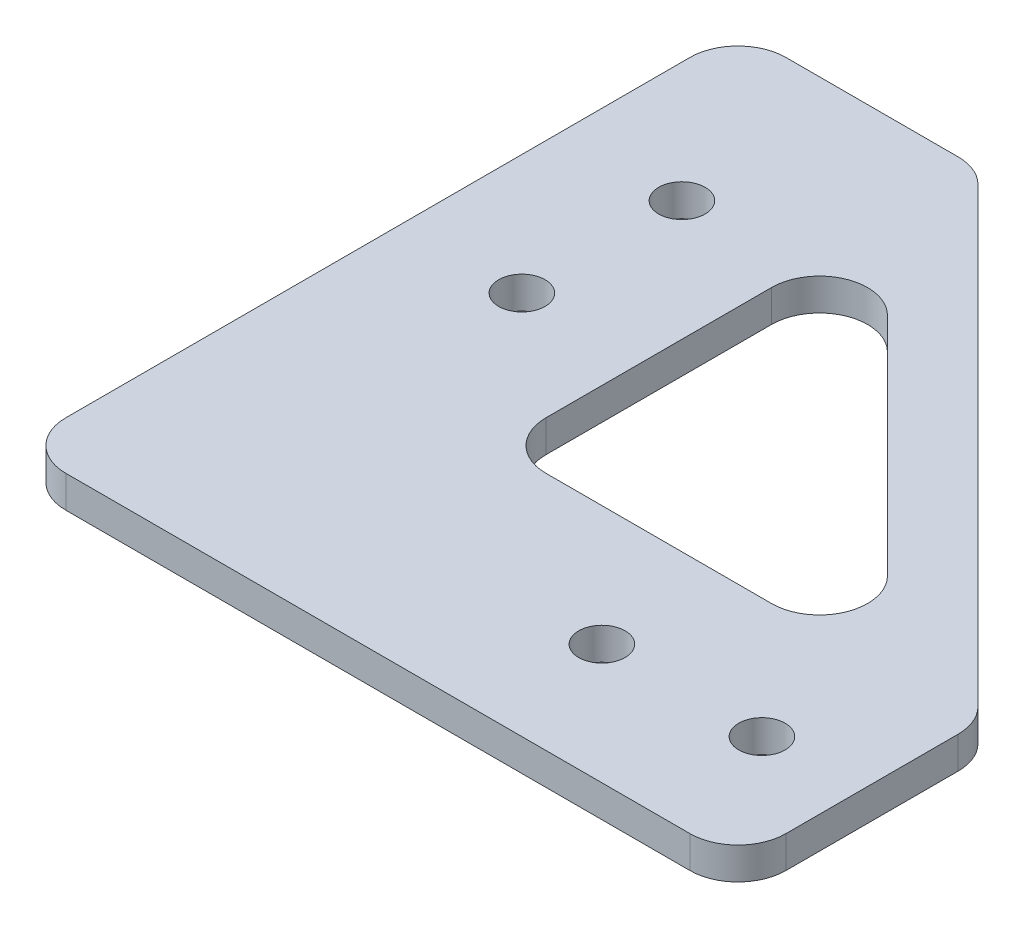
ISO-10303-21;
HEADER;
FILE_DESCRIPTION(('STEP AP214'),'2;1');
FILE_NAME('part.step','',(''),(''),'','','');
FILE_SCHEMA(('AUTOMOTIVE_DESIGN { 1 0 10303 214 1 1 1 1 }'));
ENDSEC;
DATA;
#1=APPLICATION_CONTEXT('core data for automotive mechanical design processes');
#2=APPLICATION_PROTOCOL_DEFINITION('international standard','automotive_design',2000,#1);
#3=PRODUCT_CONTEXT('',#1,'mechanical');
#4=PRODUCT('Part','Part','',(#3));
#5=PRODUCT_RELATED_PRODUCT_CATEGORY('part','',(#4));
#6=PRODUCT_DEFINITION_FORMATION('','',#4);
#7=PRODUCT_DEFINITION_CONTEXT('part definition',#1,'design');
#8=PRODUCT_DEFINITION('design','',#6,#7);
#9=PRODUCT_DEFINITION_SHAPE('','',#8);
#10=(LENGTH_UNIT() NAMED_UNIT(*) SI_UNIT(.MILLI.,.METRE.));
#11=(NAMED_UNIT(*) PLANE_ANGLE_UNIT() SI_UNIT($,.RADIAN.));
#12=(NAMED_UNIT(*) SI_UNIT($,.STERADIAN.) SOLID_ANGLE_UNIT());
#13=UNCERTAINTY_MEASURE_WITH_UNIT(LENGTH_MEASURE(1.E-05),#10,'distance_accuracy_value','');
#14=(GEOMETRIC_REPRESENTATION_CONTEXT(3) GLOBAL_UNCERTAINTY_ASSIGNED_CONTEXT((#13)) GLOBAL_UNIT_ASSIGNED_CONTEXT((#10,
#11,#12)) REPRESENTATION_CONTEXT('',''));
#15=CARTESIAN_POINT('',(0.,0.,0.));
#16=DIRECTION('',(0.,0.,1.));
#17=DIRECTION('',(1.,0.,0.));
#18=AXIS2_PLACEMENT_3D('',#15,#16,#17);
#19=CARTESIAN_POINT('',(0.,2.,-45.));
#20=DIRECTION('',(0.,0.,-1.));
#21=DIRECTION('',(-1.,0.,0.));
#22=AXIS2_PLACEMENT_3D('',#19,#20,#21);
#23=PLANE('',#22);
#24=DIRECTION('',(1.,0.,0.));
#25=VECTOR('',#24,1.);
#26=CARTESIAN_POINT('',(0.,0.,-45.));
#27=LINE('',#26,#25);
#28=CARTESIAN_POINT('',(3.,0.,-45.));
#29=VERTEX_POINT('',#28);
#30=CARTESIAN_POINT('',(13.7573593128807,0.,-45.));
#31=VERTEX_POINT('',#30);
#32=EDGE_CURVE('E312',#29,#31,#27,.T.);
#33=ORIENTED_EDGE('',*,*,#32,.F.);
#34=DIRECTION('',(0.,-1.,0.));
#35=VECTOR('',#34,1.);
#36=CARTESIAN_POINT('',(3.,2.,-45.));
#37=LINE('',#36,#35);
#38=CARTESIAN_POINT('',(3.,2.,-45.));
#39=VERTEX_POINT('',#38);
#40=EDGE_CURVE('E221',#29,#39,#37,.F.);
#41=ORIENTED_EDGE('',*,*,#40,.T.);
#42=DIRECTION('',(1.,0.,0.));
#43=VECTOR('',#42,1.);
#44=CARTESIAN_POINT('',(0.,2.,-45.));
#45=LINE('',#44,#43);
#46=CARTESIAN_POINT('',(13.7573593128807,2.,-45.));
#47=VERTEX_POINT('',#46);
#48=EDGE_CURVE('E281',#39,#47,#45,.T.);
#49=ORIENTED_EDGE('',*,*,#48,.T.);
#50=DIRECTION('',(0.,-1.,0.));
#51=VECTOR('',#50,1.);
#52=CARTESIAN_POINT('',(13.7573593128807,2.,-45.));
#53=LINE('',#52,#51);
#54=EDGE_CURVE('E218',#47,#31,#53,.T.);
#55=ORIENTED_EDGE('',*,*,#54,.T.);
#56=EDGE_LOOP('',(#33,#41,#49,#55));
#57=FACE_BOUND('',#56,.T.);
#58=ADVANCED_FACE('F45',(#57),#23,.T.);
#59=CARTESIAN_POINT('',(0.,2.,0.));
#60=DIRECTION('',(-1.,0.,0.));
#61=DIRECTION('',(0.,0.,1.));
#62=AXIS2_PLACEMENT_3D('',#59,#60,#61);
#63=PLANE('',#62);
#64=DIRECTION('',(0.,0.,-1.));
#65=VECTOR('',#64,1.);
#66=CARTESIAN_POINT('',(0.,0.,0.));
#67=LINE('',#66,#65);
#68=CARTESIAN_POINT('',(0.,0.,-3.));
#69=VERTEX_POINT('',#68);
#70=CARTESIAN_POINT('',(0.,0.,-42.));
#71=VERTEX_POINT('',#70);
#72=EDGE_CURVE('E189',#69,#71,#67,.T.);
#73=ORIENTED_EDGE('',*,*,#72,.F.);
#74=DIRECTION('',(0.,-1.,0.));
#75=VECTOR('',#74,1.);
#76=CARTESIAN_POINT('',(0.,2.,-3.));
#77=LINE('',#76,#75);
#78=CARTESIAN_POINT('',(0.,2.,-3.));
#79=VERTEX_POINT('',#78);
#80=EDGE_CURVE('E216',#69,#79,#77,.F.);
#81=ORIENTED_EDGE('',*,*,#80,.T.);
#82=DIRECTION('',(0.,0.,-1.));
#83=VECTOR('',#82,1.);
#84=CARTESIAN_POINT('',(0.,2.,0.));
#85=LINE('',#84,#83);
#86=CARTESIAN_POINT('',(0.,2.,-42.));
#87=VERTEX_POINT('',#86);
#88=EDGE_CURVE('E289',#79,#87,#85,.T.);
#89=ORIENTED_EDGE('',*,*,#88,.T.);
#90=DIRECTION('',(0.,-1.,0.));
#91=VECTOR('',#90,1.);
#92=CARTESIAN_POINT('',(0.,2.,-42.));
#93=LINE('',#92,#91);
#94=EDGE_CURVE('E213',#87,#71,#93,.T.);
#95=ORIENTED_EDGE('',*,*,#94,.T.);
#96=EDGE_LOOP('',(#73,#81,#89,#95));
#97=FACE_BOUND('',#96,.T.);
#98=ADVANCED_FACE('F319',(#97),#63,.T.);
#99=CARTESIAN_POINT('',(0.,2.,0.));
#100=DIRECTION('',(0.,0.,-1.));
#101=DIRECTION('',(-1.,0.,0.));
#102=AXIS2_PLACEMENT_3D('',#99,#100,#101);
#103=PLANE('',#102);
#104=DIRECTION('',(1.,0.,0.));
#105=VECTOR('',#104,1.);
#106=CARTESIAN_POINT('',(0.,0.,0.));
#107=LINE('',#106,#105);
#108=CARTESIAN_POINT('',(3.,0.,0.));
#109=VERTEX_POINT('',#108);
#110=CARTESIAN_POINT('',(42.,0.,0.));
#111=VERTEX_POINT('',#110);
#112=EDGE_CURVE('E185',#109,#111,#107,.T.);
#113=ORIENTED_EDGE('',*,*,#112,.T.);
#114=DIRECTION('',(0.,-1.,0.));
#115=VECTOR('',#114,1.);
#116=CARTESIAN_POINT('',(42.,2.,0.));
#117=LINE('',#116,#115);
#118=CARTESIAN_POINT('',(42.,2.,0.));
#119=VERTEX_POINT('',#118);
#120=EDGE_CURVE('E164',#111,#119,#117,.F.);
#121=ORIENTED_EDGE('',*,*,#120,.T.);
#122=DIRECTION('',(1.,0.,0.));
#123=VECTOR('',#122,1.);
#124=CARTESIAN_POINT('',(0.,2.,0.));
#125=LINE('',#124,#123);
#126=CARTESIAN_POINT('',(3.,2.,0.));
#127=VERTEX_POINT('',#126);
#128=EDGE_CURVE('E292',#127,#119,#125,.T.);
#129=ORIENTED_EDGE('',*,*,#128,.F.);
#130=DIRECTION('',(0.,-1.,0.));
#131=VECTOR('',#130,1.);
#132=CARTESIAN_POINT('',(3.,0.,0.));
#133=LINE('',#132,#131);
#134=EDGE_CURVE('E169',#127,#109,#133,.T.);
#135=ORIENTED_EDGE('',*,*,#134,.T.);
#136=EDGE_LOOP('',(#113,#121,#129,#135));
#137=FACE_BOUND('',#136,.T.);
#138=ADVANCED_FACE('F328',(#137),#103,.F.);
#139=CARTESIAN_POINT('',(45.,2.,0.));
#140=DIRECTION('',(-1.,0.,0.));
#141=DIRECTION('',(0.,0.,1.));
#142=AXIS2_PLACEMENT_3D('',#139,#140,#141);
#143=PLANE('',#142);
#144=DIRECTION('',(0.,0.,-1.));
#145=VECTOR('',#144,1.);
#146=CARTESIAN_POINT('',(45.,2.,0.));
#147=LINE('',#146,#145);
#148=CARTESIAN_POINT('',(45.,2.,-3.));
#149=VERTEX_POINT('',#148);
#150=CARTESIAN_POINT('',(45.,2.,-13.7573593128807));
#151=VERTEX_POINT('',#150);
#152=EDGE_CURVE('E178',#149,#151,#147,.T.);
#153=ORIENTED_EDGE('',*,*,#152,.F.);
#154=DIRECTION('',(0.,-1.,0.));
#155=VECTOR('',#154,1.);
#156=CARTESIAN_POINT('',(45.,2.,-3.));
#157=LINE('',#156,#155);
#158=CARTESIAN_POINT('',(45.,0.,-3.));
#159=VERTEX_POINT('',#158);
#160=EDGE_CURVE('E163',#149,#159,#157,.T.);
#161=ORIENTED_EDGE('',*,*,#160,.T.);
#162=DIRECTION('',(0.,0.,-1.));
#163=VECTOR('',#162,1.);
#164=CARTESIAN_POINT('',(45.,0.,0.));
#165=LINE('',#164,#163);
#166=CARTESIAN_POINT('',(45.,0.,-13.7573593128807));
#167=VERTEX_POINT('',#166);
#168=EDGE_CURVE('E176',#159,#167,#165,.T.);
#169=ORIENTED_EDGE('',*,*,#168,.T.);
#170=DIRECTION('',(0.,-1.,0.));
#171=VECTOR('',#170,1.);
#172=CARTESIAN_POINT('',(45.,2.,-13.7573593128807));
#173=LINE('',#172,#171);
#174=EDGE_CURVE('E180',#167,#151,#173,.F.);
#175=ORIENTED_EDGE('',*,*,#174,.T.);
#176=EDGE_LOOP('',(#153,#161,#169,#175));
#177=FACE_BOUND('',#176,.T.);
#178=ADVANCED_FACE('F175',(#177),#143,.F.);
#179=CARTESIAN_POINT('',(27.1715728752538,2.,-27.1715728752538));
#180=DIRECTION('',(-0.707106781186547,0.,0.707106781186548));
#181=DIRECTION('',(0.707106781186548,0.,0.707106781186547));
#182=AXIS2_PLACEMENT_3D('',#179,#180,#181);
#183=PLANE('',#182);
#184=DIRECTION('',(-0.707106781186548,0.,-0.707106781186547));
#185=VECTOR('',#184,1.);
#186=CARTESIAN_POINT('',(27.1715728752538,2.,-27.1715728752538));
#187=LINE('',#186,#185);
#188=CARTESIAN_POINT('',(34.221825406948,2.,-20.1213203435596));
#189=VERTEX_POINT('',#188);
#190=CARTESIAN_POINT('',(20.1213203435596,2.,-34.221825406948));
#191=VERTEX_POINT('',#190);
#192=EDGE_CURVE('E274',#189,#191,#187,.T.);
#193=ORIENTED_EDGE('',*,*,#192,.T.);
#194=DIRECTION('',(0.,-1.,0.));
#195=VECTOR('',#194,1.);
#196=CARTESIAN_POINT('',(20.1213203435596,0.,-34.221825406948));
#197=LINE('',#196,#195);
#198=CARTESIAN_POINT('',(20.1213203435596,0.,-34.221825406948));
#199=VERTEX_POINT('',#198);
#200=EDGE_CURVE('E225',#191,#199,#197,.T.);
#201=ORIENTED_EDGE('',*,*,#200,.T.);
#202=DIRECTION('',(-0.707106781186548,0.,-0.707106781186547));
#203=VECTOR('',#202,1.);
#204=CARTESIAN_POINT('',(27.1715728752538,0.,-27.1715728752538));
#205=LINE('',#204,#203);
#206=CARTESIAN_POINT('',(34.221825406948,0.,-20.1213203435596));
#207=VERTEX_POINT('',#206);
#208=EDGE_CURVE('E253',#207,#199,#205,.T.);
#209=ORIENTED_EDGE('',*,*,#208,.F.);
#210=DIRECTION('',(0.,-1.,0.));
#211=VECTOR('',#210,1.);
#212=CARTESIAN_POINT('',(34.221825406948,2.,-20.1213203435596));
#213=LINE('',#212,#211);
#214=EDGE_CURVE('E223',#207,#189,#213,.F.);
#215=ORIENTED_EDGE('',*,*,#214,.T.);
#216=EDGE_LOOP('',(#193,#201,#209,#215));
#217=FACE_BOUND('',#216,.T.);
#218=ADVANCED_FACE('F261',(#217),#183,.T.);
#219=CARTESIAN_POINT('',(0.,2.,-15.));
#220=DIRECTION('',(0.,0.,-1.));
#221=DIRECTION('',(-1.,0.,0.));
#222=AXIS2_PLACEMENT_3D('',#219,#220,#221);
#223=PLANE('',#222);
#224=DIRECTION('',(1.,0.,0.));
#225=VECTOR('',#224,1.);
#226=CARTESIAN_POINT('',(0.,0.,-15.));
#227=LINE('',#226,#225);
#228=CARTESIAN_POINT('',(18.,0.,-15.));
#229=VERTEX_POINT('',#228);
#230=CARTESIAN_POINT('',(32.1005050633883,0.,-15.));
#231=VERTEX_POINT('',#230);
#232=EDGE_CURVE('E255',#229,#231,#227,.T.);
#233=ORIENTED_EDGE('',*,*,#232,.F.);
#234=DIRECTION('',(0.,-1.,0.));
#235=VECTOR('',#234,1.);
#236=CARTESIAN_POINT('',(18.,2.,-15.));
#237=LINE('',#236,#235);
#238=CARTESIAN_POINT('',(18.,2.,-15.));
#239=VERTEX_POINT('',#238);
#240=EDGE_CURVE('E236',#229,#239,#237,.F.);
#241=ORIENTED_EDGE('',*,*,#240,.T.);
#242=DIRECTION('',(1.,0.,0.));
#243=VECTOR('',#242,1.);
#244=CARTESIAN_POINT('',(0.,2.,-15.));
#245=LINE('',#244,#243);
#246=CARTESIAN_POINT('',(32.1005050633883,2.,-15.));
#247=VERTEX_POINT('',#246);
#248=EDGE_CURVE('E272',#239,#247,#245,.T.);
#249=ORIENTED_EDGE('',*,*,#248,.T.);
#250=DIRECTION('',(0.,-1.,0.));
#251=VECTOR('',#250,1.);
#252=CARTESIAN_POINT('',(32.1005050633883,0.,-15.));
#253=LINE('',#252,#251);
#254=EDGE_CURVE('E233',#247,#231,#253,.T.);
#255=ORIENTED_EDGE('',*,*,#254,.T.);
#256=EDGE_LOOP('',(#233,#241,#249,#255));
#257=FACE_BOUND('',#256,.T.);
#258=ADVANCED_FACE('F276',(#257),#223,.T.);
#259=CARTESIAN_POINT('',(15.,2.,0.));
#260=DIRECTION('',(1.,0.,0.));
#261=DIRECTION('',(0.,0.,-1.));
#262=AXIS2_PLACEMENT_3D('',#259,#260,#261);
#263=PLANE('',#262);
#264=DIRECTION('',(0.,0.,1.));
#265=VECTOR('',#264,1.);
#266=CARTESIAN_POINT('',(15.,0.,0.));
#267=LINE('',#266,#265);
#268=CARTESIAN_POINT('',(15.,0.,-32.1005050633883));
#269=VERTEX_POINT('',#268);
#270=CARTESIAN_POINT('',(15.,0.,-18.));
#271=VERTEX_POINT('',#270);
#272=EDGE_CURVE('E309',#269,#271,#267,.T.);
#273=ORIENTED_EDGE('',*,*,#272,.F.);
#274=DIRECTION('',(0.,-1.,0.));
#275=VECTOR('',#274,1.);
#276=CARTESIAN_POINT('',(15.,2.,-32.1005050633883));
#277=LINE('',#276,#275);
#278=CARTESIAN_POINT('',(15.,2.,-32.1005050633883));
#279=VERTEX_POINT('',#278);
#280=EDGE_CURVE('E231',#269,#279,#277,.F.);
#281=ORIENTED_EDGE('',*,*,#280,.T.);
#282=DIRECTION('',(0.,0.,1.));
#283=VECTOR('',#282,1.);
#284=CARTESIAN_POINT('',(15.,2.,0.));
#285=LINE('',#284,#283);
#286=CARTESIAN_POINT('',(15.,2.,-18.));
#287=VERTEX_POINT('',#286);
#288=EDGE_CURVE('E278',#279,#287,#285,.T.);
#289=ORIENTED_EDGE('',*,*,#288,.T.);
#290=DIRECTION('',(0.,-1.,0.));
#291=VECTOR('',#290,1.);
#292=CARTESIAN_POINT('',(15.,0.,-18.));
#293=LINE('',#292,#291);
#294=EDGE_CURVE('E228',#287,#271,#293,.T.);
#295=ORIENTED_EDGE('',*,*,#294,.T.);
#296=EDGE_LOOP('',(#273,#281,#289,#295));
#297=FACE_BOUND('',#296,.T.);
#298=ADVANCED_FACE('F344',(#297),#263,.T.);
#299=CARTESIAN_POINT('',(29.,2.,-7.5));
#300=DIRECTION('',(0.,-1.,0.));
#301=DIRECTION('',(0.,0.,-1.));
#302=AXIS2_PLACEMENT_3D('',#299,#300,#301);
#303=CYLINDRICAL_SURFACE('',#302,1.45);
#304=CARTESIAN_POINT('',(29.,2.,-7.5));
#305=DIRECTION('',(0.,1.,0.));
#306=DIRECTION('',(0.,0.,1.));
#307=AXIS2_PLACEMENT_3D('',#304,#305,#306);
#308=CIRCLE('',#307,1.45);
#309=CARTESIAN_POINT('',(29.,2.,-6.05));
#310=VERTEX_POINT('',#309);
#311=EDGE_CURVE('E283',#310,#310,#308,.T.);
#312=ORIENTED_EDGE('',*,*,#311,.T.);
#313=EDGE_LOOP('',(#312));
#314=FACE_BOUND('',#313,.T.);
#315=CARTESIAN_POINT('',(29.,0.,-7.5));
#316=DIRECTION('',(0.,1.,0.));
#317=DIRECTION('',(0.,0.,1.));
#318=AXIS2_PLACEMENT_3D('',#315,#316,#317);
#319=CIRCLE('',#318,1.45);
#320=CARTESIAN_POINT('',(29.,0.,-6.05));
#321=VERTEX_POINT('',#320);
#322=EDGE_CURVE('E264',#321,#321,#319,.T.);
#323=ORIENTED_EDGE('',*,*,#322,.F.);
#324=EDGE_LOOP('',(#323));
#325=FACE_BOUND('',#324,.T.);
#326=ADVANCED_FACE('F347',(#314,#325),#303,.F.);
#327=CARTESIAN_POINT('',(39.,2.,-7.5));
#328=DIRECTION('',(0.,-1.,0.));
#329=DIRECTION('',(0.,0.,-1.));
#330=AXIS2_PLACEMENT_3D('',#327,#328,#329);
#331=CYLINDRICAL_SURFACE('',#330,1.45);
#332=CARTESIAN_POINT('',(39.,2.,-7.5));
#333=DIRECTION('',(0.,1.,0.));
#334=DIRECTION('',(0.,0.,1.));
#335=AXIS2_PLACEMENT_3D('',#332,#333,#334);
#336=CIRCLE('',#335,1.45);
#337=CARTESIAN_POINT('',(39.,2.,-6.05));
#338=VERTEX_POINT('',#337);
#339=EDGE_CURVE('E559',#338,#338,#336,.T.);
#340=ORIENTED_EDGE('',*,*,#339,.T.);
#341=EDGE_LOOP('',(#340));
#342=FACE_BOUND('',#341,.T.);
#343=CARTESIAN_POINT('',(39.,0.,-7.5));
#344=DIRECTION('',(0.,1.,0.));
#345=DIRECTION('',(0.,0.,1.));
#346=AXIS2_PLACEMENT_3D('',#343,#344,#345);
#347=CIRCLE('',#346,1.45);
#348=CARTESIAN_POINT('',(39.,0.,-6.05));
#349=VERTEX_POINT('',#348);
#350=EDGE_CURVE('E303',#349,#349,#347,.T.);
#351=ORIENTED_EDGE('',*,*,#350,.F.);
#352=EDGE_LOOP('',(#351));
#353=FACE_BOUND('',#352,.T.);
#354=ADVANCED_FACE('F355',(#342,#353),#331,.F.);
#355=CARTESIAN_POINT('',(7.5,2.,-24.));
#356=DIRECTION('',(0.,-1.,0.));
#357=DIRECTION('',(0.,0.,-1.));
#358=AXIS2_PLACEMENT_3D('',#355,#356,#357);
#359=CYLINDRICAL_SURFACE('',#358,1.45);
#360=CARTESIAN_POINT('',(7.5,2.,-24.));
#361=DIRECTION('',(0.,1.,0.));
#362=DIRECTION('',(0.,0.,1.));
#363=AXIS2_PLACEMENT_3D('',#360,#361,#362);
#364=CIRCLE('',#363,1.45);
#365=CARTESIAN_POINT('',(7.5,2.,-22.55));
#366=VERTEX_POINT('',#365);
#367=EDGE_CURVE('E555',#366,#366,#364,.T.);
#368=ORIENTED_EDGE('',*,*,#367,.T.);
#369=EDGE_LOOP('',(#368));
#370=FACE_BOUND('',#369,.T.);
#371=CARTESIAN_POINT('',(7.5,0.,-24.));
#372=DIRECTION('',(0.,1.,0.));
#373=DIRECTION('',(0.,0.,1.));
#374=AXIS2_PLACEMENT_3D('',#371,#372,#373);
#375=CIRCLE('',#374,1.45);
#376=CARTESIAN_POINT('',(7.5,0.,-22.55));
#377=VERTEX_POINT('',#376);
#378=EDGE_CURVE('E300',#377,#377,#375,.T.);
#379=ORIENTED_EDGE('',*,*,#378,.F.);
#380=EDGE_LOOP('',(#379));
#381=FACE_BOUND('',#380,.T.);
#382=ADVANCED_FACE('F359',(#370,#381),#359,.F.);
#383=CARTESIAN_POINT('',(7.5,2.,-34.));
#384=DIRECTION('',(0.,-1.,0.));
#385=DIRECTION('',(0.,0.,-1.));
#386=AXIS2_PLACEMENT_3D('',#383,#384,#385);
#387=CYLINDRICAL_SURFACE('',#386,1.45);
#388=CARTESIAN_POINT('',(7.5,2.,-34.));
#389=DIRECTION('',(0.,1.,0.));
#390=DIRECTION('',(0.,0.,1.));
#391=AXIS2_PLACEMENT_3D('',#388,#389,#390);
#392=CIRCLE('',#391,1.45);
#393=CARTESIAN_POINT('',(7.5,2.,-32.55));
#394=VERTEX_POINT('',#393);
#395=EDGE_CURVE('E187',#394,#394,#392,.T.);
#396=ORIENTED_EDGE('',*,*,#395,.T.);
#397=EDGE_LOOP('',(#396));
#398=FACE_BOUND('',#397,.T.);
#399=CARTESIAN_POINT('',(7.5,0.,-34.));
#400=DIRECTION('',(0.,1.,0.));
#401=DIRECTION('',(0.,0.,1.));
#402=AXIS2_PLACEMENT_3D('',#399,#400,#401);
#403=CIRCLE('',#402,1.45);
#404=CARTESIAN_POINT('',(7.5,0.,-32.55));
#405=VERTEX_POINT('',#404);
#406=EDGE_CURVE('E297',#405,#405,#403,.T.);
#407=ORIENTED_EDGE('',*,*,#406,.F.);
#408=EDGE_LOOP('',(#407));
#409=FACE_BOUND('',#408,.T.);
#410=ADVANCED_FACE('F363',(#398,#409),#387,.F.);
#411=CARTESIAN_POINT('',(30.,2.,-30.));
#412=DIRECTION('',(0.707106781186547,0.,-0.707106781186548));
#413=DIRECTION('',(-0.707106781186548,0.,-0.707106781186547));
#414=AXIS2_PLACEMENT_3D('',#411,#412,#413);
#415=PLANE('',#414);
#416=DIRECTION('',(0.707106781186548,0.,0.707106781186547));
#417=VECTOR('',#416,1.);
#418=CARTESIAN_POINT('',(30.,0.,-30.));
#419=LINE('',#418,#417);
#420=CARTESIAN_POINT('',(15.8786796564404,0.,-44.1213203435596));
#421=VERTEX_POINT('',#420);
#422=CARTESIAN_POINT('',(44.1213203435596,0.,-15.8786796564404));
#423=VERTEX_POINT('',#422);
#424=EDGE_CURVE('E184',#421,#423,#419,.T.);
#425=ORIENTED_EDGE('',*,*,#424,.F.);
#426=DIRECTION('',(0.,-1.,0.));
#427=VECTOR('',#426,1.);
#428=CARTESIAN_POINT('',(15.8786796564404,2.,-44.1213203435596));
#429=LINE('',#428,#427);
#430=CARTESIAN_POINT('',(15.8786796564404,2.,-44.1213203435596));
#431=VERTEX_POINT('',#430);
#432=EDGE_CURVE('E67',#421,#431,#429,.F.);
#433=ORIENTED_EDGE('',*,*,#432,.T.);
#434=DIRECTION('',(0.707106781186548,0.,0.707106781186547));
#435=VECTOR('',#434,1.);
#436=CARTESIAN_POINT('',(30.,2.,-30.));
#437=LINE('',#436,#435);
#438=CARTESIAN_POINT('',(44.1213203435596,2.,-15.8786796564404));
#439=VERTEX_POINT('',#438);
#440=EDGE_CURVE('E193',#431,#439,#437,.T.);
#441=ORIENTED_EDGE('',*,*,#440,.T.);
#442=DIRECTION('',(0.,-1.,0.));
#443=VECTOR('',#442,1.);
#444=CARTESIAN_POINT('',(44.1213203435596,0.,-15.8786796564404));
#445=LINE('',#444,#443);
#446=EDGE_CURVE('E238',#439,#423,#445,.T.);
#447=ORIENTED_EDGE('',*,*,#446,.T.);
#448=EDGE_LOOP('',(#425,#433,#441,#447));
#449=FACE_BOUND('',#448,.T.);
#450=ADVANCED_FACE('F366',(#449),#415,.T.);
#451=CARTESIAN_POINT('',(0.,2.,0.));
#452=DIRECTION('',(0.,1.,0.));
#453=DIRECTION('',(0.,0.,1.));
#454=AXIS2_PLACEMENT_3D('',#451,#452,#453);
#455=PLANE('',#454);
#456=ORIENTED_EDGE('',*,*,#395,.F.);
#457=EDGE_LOOP('',(#456));
#458=FACE_BOUND('',#457,.T.);
#459=ORIENTED_EDGE('',*,*,#367,.F.);
#460=EDGE_LOOP('',(#459));
#461=FACE_BOUND('',#460,.T.);
#462=ORIENTED_EDGE('',*,*,#339,.F.);
#463=EDGE_LOOP('',(#462));
#464=FACE_BOUND('',#463,.T.);
#465=ORIENTED_EDGE('',*,*,#311,.F.);
#466=EDGE_LOOP('',(#465));
#467=FACE_BOUND('',#466,.T.);
#468=ORIENTED_EDGE('',*,*,#192,.F.);
#469=CARTESIAN_POINT('',(32.1005050633883,2.,-18.));
#470=DIRECTION('',(0.,1.,0.));
#471=DIRECTION('',(0.,0.,1.));
#472=AXIS2_PLACEMENT_3D('',#469,#470,#471);
#473=CIRCLE('',#472,3.);
#474=EDGE_CURVE('E11',#189,#247,#473,.F.);
#475=ORIENTED_EDGE('',*,*,#474,.T.);
#476=ORIENTED_EDGE('',*,*,#248,.F.);
#477=CARTESIAN_POINT('',(18.,2.,-18.));
#478=DIRECTION('',(0.,1.,0.));
#479=DIRECTION('',(0.,0.,1.));
#480=AXIS2_PLACEMENT_3D('',#477,#478,#479);
#481=CIRCLE('',#480,3.);
#482=EDGE_CURVE('E248',#239,#287,#481,.F.);
#483=ORIENTED_EDGE('',*,*,#482,.T.);
#484=ORIENTED_EDGE('',*,*,#288,.F.);
#485=CARTESIAN_POINT('',(18.,2.,-32.1005050633883));
#486=DIRECTION('',(0.,1.,0.));
#487=DIRECTION('',(0.,0.,1.));
#488=AXIS2_PLACEMENT_3D('',#485,#486,#487);
#489=CIRCLE('',#488,3.);
#490=EDGE_CURVE('E244',#279,#191,#489,.F.);
#491=ORIENTED_EDGE('',*,*,#490,.T.);
#492=EDGE_LOOP('',(#468,#475,#476,#483,#484,#491));
#493=FACE_BOUND('',#492,.T.);
#494=ORIENTED_EDGE('',*,*,#128,.T.);
#495=CARTESIAN_POINT('',(42.,2.,-3.));
#496=DIRECTION('',(0.,1.,0.));
#497=DIRECTION('',(0.,0.,1.));
#498=AXIS2_PLACEMENT_3D('',#495,#496,#497);
#499=CIRCLE('',#498,3.);
#500=EDGE_CURVE('E211',#119,#149,#499,.T.);
#501=ORIENTED_EDGE('',*,*,#500,.T.);
#502=ORIENTED_EDGE('',*,*,#152,.T.);
#503=CARTESIAN_POINT('',(42.,2.,-13.7573593128807));
#504=DIRECTION('',(0.,1.,0.));
#505=DIRECTION('',(0.,0.,1.));
#506=AXIS2_PLACEMENT_3D('',#503,#504,#505);
#507=CIRCLE('',#506,3.);
#508=EDGE_CURVE('E60',#151,#439,#507,.T.);
#509=ORIENTED_EDGE('',*,*,#508,.T.);
#510=ORIENTED_EDGE('',*,*,#440,.F.);
#511=CARTESIAN_POINT('',(13.7573593128807,2.,-42.));
#512=DIRECTION('',(0.,1.,0.));
#513=DIRECTION('',(0.,0.,1.));
#514=AXIS2_PLACEMENT_3D('',#511,#512,#513);
#515=CIRCLE('',#514,3.);
#516=EDGE_CURVE('E205',#431,#47,#515,.T.);
#517=ORIENTED_EDGE('',*,*,#516,.T.);
#518=ORIENTED_EDGE('',*,*,#48,.F.);
#519=CARTESIAN_POINT('',(3.,2.,-42.));
#520=DIRECTION('',(0.,1.,0.));
#521=DIRECTION('',(0.,0.,1.));
#522=AXIS2_PLACEMENT_3D('',#519,#520,#521);
#523=CIRCLE('',#522,3.);
#524=EDGE_CURVE('E207',#39,#87,#523,.T.);
#525=ORIENTED_EDGE('',*,*,#524,.T.);
#526=ORIENTED_EDGE('',*,*,#88,.F.);
#527=CARTESIAN_POINT('',(3.,2.,-3.));
#528=DIRECTION('',(0.,1.,0.));
#529=DIRECTION('',(0.,0.,1.));
#530=AXIS2_PLACEMENT_3D('',#527,#528,#529);
#531=CIRCLE('',#530,3.);
#532=EDGE_CURVE('E209',#79,#127,#531,.T.);
#533=ORIENTED_EDGE('',*,*,#532,.T.);
#534=EDGE_LOOP('',(#494,#501,#502,#509,#510,#517,#518,#525,#526,#533));
#535=FACE_BOUND('',#534,.T.);
#536=ADVANCED_FACE('F271',(#458,#461,#464,#467,#493,#535),#455,.T.);
#537=CARTESIAN_POINT('',(0.,0.,0.));
#538=DIRECTION('',(0.,1.,0.));
#539=DIRECTION('',(0.,0.,1.));
#540=AXIS2_PLACEMENT_3D('',#537,#538,#539);
#541=PLANE('',#540);
#542=ORIENTED_EDGE('',*,*,#406,.T.);
#543=EDGE_LOOP('',(#542));
#544=FACE_BOUND('',#543,.T.);
#545=ORIENTED_EDGE('',*,*,#378,.T.);
#546=EDGE_LOOP('',(#545));
#547=FACE_BOUND('',#546,.T.);
#548=ORIENTED_EDGE('',*,*,#350,.T.);
#549=EDGE_LOOP('',(#548));
#550=FACE_BOUND('',#549,.T.);
#551=ORIENTED_EDGE('',*,*,#322,.T.);
#552=EDGE_LOOP('',(#551));
#553=FACE_BOUND('',#552,.T.);
#554=ORIENTED_EDGE('',*,*,#232,.T.);
#555=CARTESIAN_POINT('',(32.1005050633883,0.,-18.));
#556=DIRECTION('',(0.,1.,0.));
#557=DIRECTION('',(0.,0.,1.));
#558=AXIS2_PLACEMENT_3D('',#555,#556,#557);
#559=CIRCLE('',#558,3.);
#560=EDGE_CURVE('E53',#231,#207,#559,.T.);
#561=ORIENTED_EDGE('',*,*,#560,.T.);
#562=ORIENTED_EDGE('',*,*,#208,.T.);
#563=CARTESIAN_POINT('',(18.,0.,-32.1005050633883));
#564=DIRECTION('',(0.,1.,0.));
#565=DIRECTION('',(0.,0.,1.));
#566=AXIS2_PLACEMENT_3D('',#563,#564,#565);
#567=CIRCLE('',#566,3.);
#568=EDGE_CURVE('E242',#199,#269,#567,.T.);
#569=ORIENTED_EDGE('',*,*,#568,.T.);
#570=ORIENTED_EDGE('',*,*,#272,.T.);
#571=CARTESIAN_POINT('',(18.,0.,-18.));
#572=DIRECTION('',(0.,1.,0.));
#573=DIRECTION('',(0.,0.,1.));
#574=AXIS2_PLACEMENT_3D('',#571,#572,#573);
#575=CIRCLE('',#574,3.);
#576=EDGE_CURVE('E246',#271,#229,#575,.T.);
#577=ORIENTED_EDGE('',*,*,#576,.T.);
#578=EDGE_LOOP('',(#554,#561,#562,#569,#570,#577));
#579=FACE_BOUND('',#578,.T.);
#580=ORIENTED_EDGE('',*,*,#168,.F.);
#581=CARTESIAN_POINT('',(42.,0.,-3.));
#582=DIRECTION('',(0.,1.,0.));
#583=DIRECTION('',(0.,0.,1.));
#584=AXIS2_PLACEMENT_3D('',#581,#582,#583);
#585=CIRCLE('',#584,3.);
#586=EDGE_CURVE('E159',#159,#111,#585,.F.);
#587=ORIENTED_EDGE('',*,*,#586,.T.);
#588=ORIENTED_EDGE('',*,*,#112,.F.);
#589=CARTESIAN_POINT('',(3.,0.,-3.));
#590=DIRECTION('',(0.,1.,0.));
#591=DIRECTION('',(0.,0.,1.));
#592=AXIS2_PLACEMENT_3D('',#589,#590,#591);
#593=CIRCLE('',#592,3.);
#594=EDGE_CURVE('E170',#109,#69,#593,.F.);
#595=ORIENTED_EDGE('',*,*,#594,.T.);
#596=ORIENTED_EDGE('',*,*,#72,.T.);
#597=CARTESIAN_POINT('',(3.,0.,-42.));
#598=DIRECTION('',(0.,1.,0.));
#599=DIRECTION('',(0.,0.,1.));
#600=AXIS2_PLACEMENT_3D('',#597,#598,#599);
#601=CIRCLE('',#600,3.);
#602=EDGE_CURVE('E198',#71,#29,#601,.F.);
#603=ORIENTED_EDGE('',*,*,#602,.T.);
#604=ORIENTED_EDGE('',*,*,#32,.T.);
#605=CARTESIAN_POINT('',(13.7573593128807,0.,-42.));
#606=DIRECTION('',(0.,1.,0.));
#607=DIRECTION('',(0.,0.,1.));
#608=AXIS2_PLACEMENT_3D('',#605,#606,#607);
#609=CIRCLE('',#608,3.);
#610=EDGE_CURVE('E196',#31,#421,#609,.F.);
#611=ORIENTED_EDGE('',*,*,#610,.T.);
#612=ORIENTED_EDGE('',*,*,#424,.T.);
#613=CARTESIAN_POINT('',(42.,0.,-13.7573593128807));
#614=DIRECTION('',(0.,1.,0.));
#615=DIRECTION('',(0.,0.,1.));
#616=AXIS2_PLACEMENT_3D('',#613,#614,#615);
#617=CIRCLE('',#616,3.);
#618=EDGE_CURVE('E179',#423,#167,#617,.F.);
#619=ORIENTED_EDGE('',*,*,#618,.T.);
#620=EDGE_LOOP('',(#580,#587,#588,#595,#596,#603,#604,#611,#612,#619));
#621=FACE_BOUND('',#620,.T.);
#622=ADVANCED_FACE('F182',(#544,#547,#550,#553,#579,#621),#541,.F.);
#623=CARTESIAN_POINT('',(42.,2.,-3.));
#624=DIRECTION('',(0.,-1.,0.));
#625=DIRECTION('',(0.,0.,-1.));
#626=AXIS2_PLACEMENT_3D('',#623,#624,#625);
#627=CYLINDRICAL_SURFACE('',#626,3.);
#628=ORIENTED_EDGE('',*,*,#500,.F.);
#629=ORIENTED_EDGE('',*,*,#120,.F.);
#630=ORIENTED_EDGE('',*,*,#586,.F.);
#631=ORIENTED_EDGE('',*,*,#160,.F.);
#632=EDGE_LOOP('',(#628,#629,#630,#631));
#633=FACE_BOUND('',#632,.T.);
#634=ADVANCED_FACE('F162',(#633),#627,.T.);
#635=CARTESIAN_POINT('',(3.,2.,-3.));
#636=DIRECTION('',(0.,1.,0.));
#637=DIRECTION('',(0.,0.,1.));
#638=AXIS2_PLACEMENT_3D('',#635,#636,#637);
#639=CYLINDRICAL_SURFACE('',#638,3.);
#640=ORIENTED_EDGE('',*,*,#532,.F.);
#641=ORIENTED_EDGE('',*,*,#80,.F.);
#642=ORIENTED_EDGE('',*,*,#594,.F.);
#643=ORIENTED_EDGE('',*,*,#134,.F.);
#644=EDGE_LOOP('',(#640,#641,#642,#643));
#645=FACE_BOUND('',#644,.T.);
#646=ADVANCED_FACE('F324',(#645),#639,.T.);
#647=CARTESIAN_POINT('',(3.,2.,-42.));
#648=DIRECTION('',(0.,-1.,0.));
#649=DIRECTION('',(0.,0.,-1.));
#650=AXIS2_PLACEMENT_3D('',#647,#648,#649);
#651=CYLINDRICAL_SURFACE('',#650,3.);
#652=ORIENTED_EDGE('',*,*,#524,.F.);
#653=ORIENTED_EDGE('',*,*,#40,.F.);
#654=ORIENTED_EDGE('',*,*,#602,.F.);
#655=ORIENTED_EDGE('',*,*,#94,.F.);
#656=EDGE_LOOP('',(#652,#653,#654,#655));
#657=FACE_BOUND('',#656,.T.);
#658=ADVANCED_FACE('F372',(#657),#651,.T.);
#659=CARTESIAN_POINT('',(18.,2.,-32.1005050633883));
#660=DIRECTION('',(0.,1.,0.));
#661=DIRECTION('',(0.,0.,1.));
#662=AXIS2_PLACEMENT_3D('',#659,#660,#661);
#663=CYLINDRICAL_SURFACE('',#662,3.);
#664=ORIENTED_EDGE('',*,*,#490,.F.);
#665=ORIENTED_EDGE('',*,*,#280,.F.);
#666=ORIENTED_EDGE('',*,*,#568,.F.);
#667=ORIENTED_EDGE('',*,*,#200,.F.);
#668=EDGE_LOOP('',(#664,#665,#666,#667));
#669=FACE_BOUND('',#668,.T.);
#670=ADVANCED_FACE('F375',(#669),#663,.F.);
#671=CARTESIAN_POINT('',(18.,2.,-18.));
#672=DIRECTION('',(0.,1.,0.));
#673=DIRECTION('',(0.,0.,1.));
#674=AXIS2_PLACEMENT_3D('',#671,#672,#673);
#675=CYLINDRICAL_SURFACE('',#674,3.);
#676=ORIENTED_EDGE('',*,*,#482,.F.);
#677=ORIENTED_EDGE('',*,*,#240,.F.);
#678=ORIENTED_EDGE('',*,*,#576,.F.);
#679=ORIENTED_EDGE('',*,*,#294,.F.);
#680=EDGE_LOOP('',(#676,#677,#678,#679));
#681=FACE_BOUND('',#680,.T.);
#682=ADVANCED_FACE('F379',(#681),#675,.F.);
#683=CARTESIAN_POINT('',(32.1005050633883,2.,-18.));
#684=DIRECTION('',(0.,1.,0.));
#685=DIRECTION('',(0.,0.,1.));
#686=AXIS2_PLACEMENT_3D('',#683,#684,#685);
#687=CYLINDRICAL_SURFACE('',#686,3.);
#688=ORIENTED_EDGE('',*,*,#474,.F.);
#689=ORIENTED_EDGE('',*,*,#214,.F.);
#690=ORIENTED_EDGE('',*,*,#560,.F.);
#691=ORIENTED_EDGE('',*,*,#254,.F.);
#692=EDGE_LOOP('',(#688,#689,#690,#691));
#693=FACE_BOUND('',#692,.T.);
#694=ADVANCED_FACE('F267',(#693),#687,.F.);
#695=CARTESIAN_POINT('',(13.7573593128807,2.,-42.));
#696=DIRECTION('',(0.,-1.,0.));
#697=DIRECTION('',(0.,0.,-1.));
#698=AXIS2_PLACEMENT_3D('',#695,#696,#697);
#699=CYLINDRICAL_SURFACE('',#698,3.);
#700=ORIENTED_EDGE('',*,*,#516,.F.);
#701=ORIENTED_EDGE('',*,*,#432,.F.);
#702=ORIENTED_EDGE('',*,*,#610,.F.);
#703=ORIENTED_EDGE('',*,*,#54,.F.);
#704=EDGE_LOOP('',(#700,#701,#702,#703));
#705=FACE_BOUND('',#704,.T.);
#706=ADVANCED_FACE('F385',(#705),#699,.T.);
#707=CARTESIAN_POINT('',(42.,2.,-13.7573593128807));
#708=DIRECTION('',(0.,1.,0.));
#709=DIRECTION('',(0.,0.,1.));
#710=AXIS2_PLACEMENT_3D('',#707,#708,#709);
#711=CYLINDRICAL_SURFACE('',#710,3.);
#712=ORIENTED_EDGE('',*,*,#508,.F.);
#713=ORIENTED_EDGE('',*,*,#174,.F.);
#714=ORIENTED_EDGE('',*,*,#618,.F.);
#715=ORIENTED_EDGE('',*,*,#446,.F.);
#716=EDGE_LOOP('',(#712,#713,#714,#715));
#717=FACE_BOUND('',#716,.T.);
#718=ADVANCED_FACE('F47',(#717),#711,.T.);
#719=CLOSED_SHELL('',(#58,#98,#138,#178,#218,#258,#298,#326,#354,#382,#410,#450,#536,#622,#634,
#646,#658,#670,#682,#694,#706,#718));
#720=MANIFOLD_SOLID_BREP('B2',#719);
#721=ADVANCED_BREP_SHAPE_REPRESENTATION('',(#18,#720),#14);
#722=SHAPE_DEFINITION_REPRESENTATION(#9,#721);
ENDSEC;
END-ISO-10303-21;
